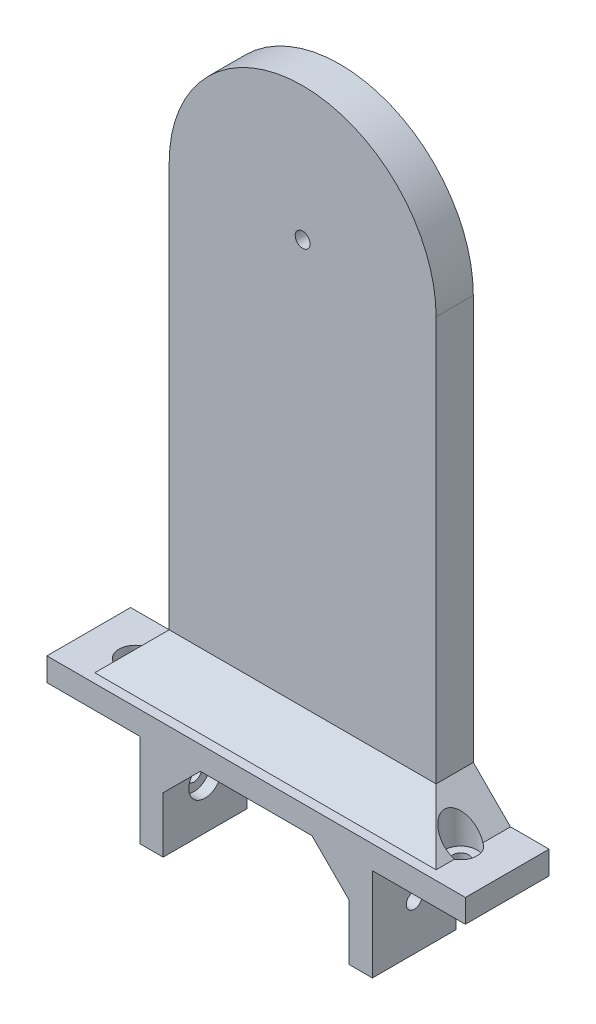
ISO-10303-21;
HEADER;
FILE_DESCRIPTION(('STEP AP214'),'2;1');
FILE_NAME('part.step','',(''),(''),'','','');
FILE_SCHEMA(('AUTOMOTIVE_DESIGN { 1 0 10303 214 1 1 1 1 }'));
ENDSEC;
DATA;
#1=APPLICATION_CONTEXT('core data for automotive mechanical design processes');
#2=APPLICATION_PROTOCOL_DEFINITION('international standard','automotive_design',2000,#1);
#3=PRODUCT_CONTEXT('',#1,'mechanical');
#4=PRODUCT('Part','Part','',(#3));
#5=PRODUCT_RELATED_PRODUCT_CATEGORY('part','',(#4));
#6=PRODUCT_DEFINITION_FORMATION('','',#4);
#7=PRODUCT_DEFINITION_CONTEXT('part definition',#1,'design');
#8=PRODUCT_DEFINITION('design','',#6,#7);
#9=PRODUCT_DEFINITION_SHAPE('','',#8);
#10=(LENGTH_UNIT() NAMED_UNIT(*) SI_UNIT(.MILLI.,.METRE.));
#11=(NAMED_UNIT(*) PLANE_ANGLE_UNIT() SI_UNIT($,.RADIAN.));
#12=(NAMED_UNIT(*) SI_UNIT($,.STERADIAN.) SOLID_ANGLE_UNIT());
#13=UNCERTAINTY_MEASURE_WITH_UNIT(LENGTH_MEASURE(1.E-05),#10,'distance_accuracy_value','');
#14=(GEOMETRIC_REPRESENTATION_CONTEXT(3) GLOBAL_UNCERTAINTY_ASSIGNED_CONTEXT((#13)) GLOBAL_UNIT_ASSIGNED_CONTEXT((#10,
#11,#12)) REPRESENTATION_CONTEXT('',''));
#15=CARTESIAN_POINT('',(0.,0.,0.));
#16=DIRECTION('',(0.,0.,1.));
#17=DIRECTION('',(1.,0.,0.));
#18=AXIS2_PLACEMENT_3D('',#15,#16,#17);
#19=CARTESIAN_POINT('',(20.,-8.00000000000006,8.));
#20=DIRECTION('',(-0.707106781186552,-0.707106781186543,0.));
#21=DIRECTION('',(0.,0.,1.));
#22=AXIS2_PLACEMENT_3D('',#19,#20,#21);
#23=PLANE('',#22);
#24=CARTESIAN_POINT('',(21.9999999999999,-10.,9.));
#25=DIRECTION('',(-0.707106781186552,-0.707106781186543,0.));
#26=DIRECTION('',(0.707106781186543,-0.707106781186552,0.));
#27=AXIS2_PLACEMENT_3D('',#24,#25,#26);
#28=ELLIPSE('',#27,4.9497474683058,3.5);
#29=CARTESIAN_POINT('',(20.,-8.00000000000006,11.8722813232691));
#30=VERTEX_POINT('',#29);
#31=CARTESIAN_POINT('',(20.,-8.00000000000006,6.12771867673095));
#32=VERTEX_POINT('',#31);
#33=EDGE_CURVE('E214',#30,#32,#28,.T.);
#34=ORIENTED_EDGE('',*,*,#33,.F.);
#35=DIRECTION('',(0.,0.,-1.));
#36=VECTOR('',#35,1.);
#37=CARTESIAN_POINT('',(20.,-8.00000000000006,0.));
#38=LINE('',#37,#36);
#39=CARTESIAN_POINT('',(20.,-8.00000000000005,18.));
#40=VERTEX_POINT('',#39);
#41=EDGE_CURVE('E426',#40,#30,#38,.T.);
#42=ORIENTED_EDGE('',*,*,#41,.F.);
#43=DIRECTION('',(-0.707106781186543,0.707106781186552,0.));
#44=VECTOR('',#43,1.);
#45=CARTESIAN_POINT('',(6.00000000000009,6.00000000000002,18.));
#46=LINE('',#45,#44);
#47=CARTESIAN_POINT('',(12.,0.,18.));
#48=VERTEX_POINT('',#47);
#49=EDGE_CURVE('E226',#48,#40,#46,.F.);
#50=ORIENTED_EDGE('',*,*,#49,.F.);
#51=DIRECTION('',(0.,0.,1.));
#52=VECTOR('',#51,1.);
#53=CARTESIAN_POINT('',(12.,0.,18.));
#54=LINE('',#53,#52);
#55=CARTESIAN_POINT('',(12.,0.,0.));
#56=VERTEX_POINT('',#55);
#57=EDGE_CURVE('E218',#56,#48,#54,.T.);
#58=ORIENTED_EDGE('',*,*,#57,.F.);
#59=DIRECTION('',(0.707106781186543,-0.707106781186552,0.));
#60=VECTOR('',#59,1.);
#61=CARTESIAN_POINT('',(6.00000000000009,6.00000000000002,0.));
#62=LINE('',#61,#60);
#63=CARTESIAN_POINT('',(20.,-8.00000000000006,0.));
#64=VERTEX_POINT('',#63);
#65=EDGE_CURVE('E228',#64,#56,#62,.F.);
#66=ORIENTED_EDGE('',*,*,#65,.F.);
#67=EDGE_CURVE('E430',#32,#64,#38,.T.);
#68=ORIENTED_EDGE('',*,*,#67,.F.);
#69=EDGE_LOOP('',(#34,#42,#50,#58,#66,#68));
#70=FACE_BOUND('',#69,.T.);
#71=ADVANCED_FACE('F43',(#70),#23,.T.);
#72=CARTESIAN_POINT('',(28.7,13.,8.));
#73=DIRECTION('',(0.707106781186544,0.707106781186551,0.));
#74=DIRECTION('',(0.,0.,1.));
#75=AXIS2_PLACEMENT_3D('',#72,#73,#74);
#76=PLANE('',#75);
#77=DIRECTION('',(0.,0.,1.));
#78=VECTOR('',#77,1.);
#79=CARTESIAN_POINT('',(36.7,5.,8.));
#80=LINE('',#79,#78);
#81=CARTESIAN_POINT('',(36.7,5.,12.0594117081556));
#82=VERTEX_POINT('',#81);
#83=CARTESIAN_POINT('',(36.7,5.,16.));
#84=VERTEX_POINT('',#83);
#85=EDGE_CURVE('E418',#82,#84,#80,.T.);
#86=ORIENTED_EDGE('',*,*,#85,.F.);
#87=CARTESIAN_POINT('',(35.,6.70000000000003,9.));
#88=DIRECTION('',(0.707106781186544,0.707106781186551,0.));
#89=DIRECTION('',(0.707106781186551,-0.707106781186544,0.));
#90=AXIS2_PLACEMENT_3D('',#87,#88,#89);
#91=ELLIPSE('',#90,4.94974746830581,3.5);
#92=CARTESIAN_POINT('',(36.7,5.,5.94058829184436));
#93=VERTEX_POINT('',#92);
#94=EDGE_CURVE('E253',#82,#93,#91,.F.);
#95=ORIENTED_EDGE('',*,*,#94,.T.);
#96=CARTESIAN_POINT('',(36.7,5.,0.));
#97=VERTEX_POINT('',#96);
#98=EDGE_CURVE('E420',#97,#93,#80,.T.);
#99=ORIENTED_EDGE('',*,*,#98,.F.);
#100=DIRECTION('',(-0.707106781186551,0.707106781186544,0.));
#101=VECTOR('',#100,1.);
#102=CARTESIAN_POINT('',(20.8499999999999,20.85,0.));
#103=LINE('',#102,#101);
#104=CARTESIAN_POINT('',(28.7,13.,0.));
#105=VERTEX_POINT('',#104);
#106=EDGE_CURVE('E217',#105,#97,#103,.F.);
#107=ORIENTED_EDGE('',*,*,#106,.F.);
#108=DIRECTION('',(0.,0.,-1.));
#109=VECTOR('',#108,1.);
#110=CARTESIAN_POINT('',(28.7,13.,0.));
#111=LINE('',#110,#109);
#112=CARTESIAN_POINT('',(28.7,13.,8.));
#113=VERTEX_POINT('',#112);
#114=EDGE_CURVE('E407',#113,#105,#111,.T.);
#115=ORIENTED_EDGE('',*,*,#114,.F.);
#116=DIRECTION('',(0.577350269189628,-0.577350269189622,0.577350269189628));
#117=VECTOR('',#116,1.);
#118=CARTESIAN_POINT('',(24.4666666666666,17.2333333333333,3.76666666666662));
#119=LINE('',#118,#117);
#120=EDGE_CURVE('E231',#113,#84,#119,.T.);
#121=ORIENTED_EDGE('',*,*,#120,.T.);
#122=EDGE_LOOP('',(#86,#95,#99,#107,#115,#121));
#123=FACE_BOUND('',#122,.T.);
#124=ADVANCED_FACE('F491',(#123),#76,.T.);
#125=CARTESIAN_POINT('',(0.,5.,8.));
#126=DIRECTION('',(0.,-1.,0.));
#127=DIRECTION('',(1.,0.,0.));
#128=AXIS2_PLACEMENT_3D('',#125,#126,#127);
#129=PLANE('',#128);
#130=DIRECTION('',(0.,0.,-1.));
#131=VECTOR('',#130,1.);
#132=CARTESIAN_POINT('',(-36.7,4.99999999999999,8.));
#133=LINE('',#132,#131);
#134=CARTESIAN_POINT('',(-36.7,4.99999999999999,16.));
#135=VERTEX_POINT('',#134);
#136=CARTESIAN_POINT('',(-36.7,4.99999999999999,12.0594117081556));
#137=VERTEX_POINT('',#136);
#138=EDGE_CURVE('E416',#135,#137,#133,.T.);
#139=ORIENTED_EDGE('',*,*,#138,.T.);
#140=CARTESIAN_POINT('',(-35.,4.99999999999999,9.));
#141=DIRECTION('',(0.,1.,0.));
#142=DIRECTION('',(0.,0.,1.));
#143=AXIS2_PLACEMENT_3D('',#140,#141,#142);
#144=CIRCLE('',#143,3.5);
#145=CARTESIAN_POINT('',(-36.7,4.99999999999999,5.94058829184435));
#146=VERTEX_POINT('',#145);
#147=EDGE_CURVE('E278',#146,#137,#144,.T.);
#148=ORIENTED_EDGE('',*,*,#147,.F.);
#149=CARTESIAN_POINT('',(-36.7,5.,0.));
#150=VERTEX_POINT('',#149);
#151=EDGE_CURVE('E411',#146,#150,#133,.T.);
#152=ORIENTED_EDGE('',*,*,#151,.T.);
#153=DIRECTION('',(1.,0.,0.));
#154=VECTOR('',#153,1.);
#155=CARTESIAN_POINT('',(0.,5.,0.));
#156=LINE('',#155,#154);
#157=CARTESIAN_POINT('',(-45.,5.,0.));
#158=VERTEX_POINT('',#157);
#159=EDGE_CURVE('E349',#158,#150,#156,.T.);
#160=ORIENTED_EDGE('',*,*,#159,.F.);
#161=DIRECTION('',(0.,0.,-1.));
#162=VECTOR('',#161,1.);
#163=CARTESIAN_POINT('',(-45.,5.,8.));
#164=LINE('',#163,#162);
#165=CARTESIAN_POINT('',(-45.,5.,18.));
#166=VERTEX_POINT('',#165);
#167=EDGE_CURVE('E405',#166,#158,#164,.T.);
#168=ORIENTED_EDGE('',*,*,#167,.F.);
#169=DIRECTION('',(-1.,0.,0.));
#170=VECTOR('',#169,1.);
#171=CARTESIAN_POINT('',(45.,5.,18.));
#172=LINE('',#171,#170);
#173=CARTESIAN_POINT('',(45.,5.,18.));
#174=VERTEX_POINT('',#173);
#175=EDGE_CURVE('E322',#174,#166,#172,.T.);
#176=ORIENTED_EDGE('',*,*,#175,.F.);
#177=DIRECTION('',(0.,0.,-1.));
#178=VECTOR('',#177,1.);
#179=CARTESIAN_POINT('',(45.,5.,8.));
#180=LINE('',#179,#178);
#181=CARTESIAN_POINT('',(45.,5.,0.));
#182=VERTEX_POINT('',#181);
#183=EDGE_CURVE('E338',#174,#182,#180,.T.);
#184=ORIENTED_EDGE('',*,*,#183,.T.);
#185=DIRECTION('',(-1.,0.,0.));
#186=VECTOR('',#185,1.);
#187=CARTESIAN_POINT('',(0.,5.,0.));
#188=LINE('',#187,#186);
#189=EDGE_CURVE('E335',#182,#97,#188,.T.);
#190=ORIENTED_EDGE('',*,*,#189,.T.);
#191=ORIENTED_EDGE('',*,*,#98,.T.);
#192=CARTESIAN_POINT('',(35.,5.,9.));
#193=DIRECTION('',(0.,1.,0.));
#194=DIRECTION('',(0.,0.,1.));
#195=AXIS2_PLACEMENT_3D('',#192,#193,#194);
#196=CIRCLE('',#195,3.5);
#197=EDGE_CURVE('E248',#82,#93,#196,.T.);
#198=ORIENTED_EDGE('',*,*,#197,.F.);
#199=ORIENTED_EDGE('',*,*,#85,.T.);
#200=DIRECTION('',(-1.,0.,0.));
#201=VECTOR('',#200,1.);
#202=CARTESIAN_POINT('',(0.,5.,16.));
#203=LINE('',#202,#201);
#204=EDGE_CURVE('E412',#84,#135,#203,.T.);
#205=ORIENTED_EDGE('',*,*,#204,.T.);
#206=EDGE_LOOP('',(#139,#148,#152,#160,#168,#176,#184,#190,#191,#198,#199,#205));
#207=FACE_BOUND('',#206,.T.);
#208=ADVANCED_FACE('F496',(#207),#129,.F.);
#209=CARTESIAN_POINT('',(28.7,0.,8.));
#210=DIRECTION('',(-1.,0.,0.));
#211=DIRECTION('',(0.,-1.,0.));
#212=AXIS2_PLACEMENT_3D('',#209,#210,#211);
#213=PLANE('',#212);
#214=DIRECTION('',(0.,1.,0.));
#215=VECTOR('',#214,1.);
#216=CARTESIAN_POINT('',(28.7,0.,8.));
#217=LINE('',#216,#215);
#218=CARTESIAN_POINT('',(28.7,100.,8.));
#219=VERTEX_POINT('',#218);
#220=EDGE_CURVE('E332',#113,#219,#217,.T.);
#221=ORIENTED_EDGE('',*,*,#220,.F.);
#222=ORIENTED_EDGE('',*,*,#114,.T.);
#223=DIRECTION('',(0.,1.,0.));
#224=VECTOR('',#223,1.);
#225=CARTESIAN_POINT('',(28.7,0.,0.));
#226=LINE('',#225,#224);
#227=CARTESIAN_POINT('',(28.7,100.,0.));
#228=VERTEX_POINT('',#227);
#229=EDGE_CURVE('E331',#105,#228,#226,.T.);
#230=ORIENTED_EDGE('',*,*,#229,.T.);
#231=DIRECTION('',(0.,0.,-1.));
#232=VECTOR('',#231,1.);
#233=CARTESIAN_POINT('',(28.7,100.,8.));
#234=LINE('',#233,#232);
#235=EDGE_CURVE('E406',#219,#228,#234,.T.);
#236=ORIENTED_EDGE('',*,*,#235,.F.);
#237=EDGE_LOOP('',(#221,#222,#230,#236));
#238=FACE_BOUND('',#237,.T.);
#239=ADVANCED_FACE('F486',(#238),#213,.F.);
#240=CARTESIAN_POINT('',(0.,100.,8.));
#241=DIRECTION('',(0.,0.,-1.));
#242=DIRECTION('',(-1.,0.,0.));
#243=AXIS2_PLACEMENT_3D('',#240,#241,#242);
#244=CYLINDRICAL_SURFACE('',#243,28.7);
#245=CARTESIAN_POINT('',(0.,100.,0.));
#246=DIRECTION('',(0.,0.,1.));
#247=DIRECTION('',(1.,0.,0.));
#248=AXIS2_PLACEMENT_3D('',#245,#246,#247);
#249=CIRCLE('',#248,28.7);
#250=CARTESIAN_POINT('',(-28.7,100.,0.));
#251=VERTEX_POINT('',#250);
#252=EDGE_CURVE('E341',#228,#251,#249,.T.);
#253=ORIENTED_EDGE('',*,*,#252,.T.);
#254=DIRECTION('',(0.,0.,-1.));
#255=VECTOR('',#254,1.);
#256=CARTESIAN_POINT('',(-28.7,100.,8.));
#257=LINE('',#256,#255);
#258=CARTESIAN_POINT('',(-28.7,100.,8.));
#259=VERTEX_POINT('',#258);
#260=EDGE_CURVE('E404',#259,#251,#257,.T.);
#261=ORIENTED_EDGE('',*,*,#260,.F.);
#262=CARTESIAN_POINT('',(0.,100.,8.));
#263=DIRECTION('',(0.,0.,1.));
#264=DIRECTION('',(1.,0.,0.));
#265=AXIS2_PLACEMENT_3D('',#262,#263,#264);
#266=CIRCLE('',#265,28.7);
#267=EDGE_CURVE('E333',#219,#259,#266,.T.);
#268=ORIENTED_EDGE('',*,*,#267,.F.);
#269=ORIENTED_EDGE('',*,*,#235,.T.);
#270=EDGE_LOOP('',(#253,#261,#268,#269));
#271=FACE_BOUND('',#270,.T.);
#272=ADVANCED_FACE('F483',(#271),#244,.T.);
#273=CARTESIAN_POINT('',(-28.7,0.,8.));
#274=DIRECTION('',(-1.,0.,0.));
#275=DIRECTION('',(0.,-1.,0.));
#276=AXIS2_PLACEMENT_3D('',#273,#274,#275);
#277=PLANE('',#276);
#278=DIRECTION('',(0.,1.,0.));
#279=VECTOR('',#278,1.);
#280=CARTESIAN_POINT('',(-28.7,0.,0.));
#281=LINE('',#280,#279);
#282=CARTESIAN_POINT('',(-28.7,13.,0.));
#283=VERTEX_POINT('',#282);
#284=EDGE_CURVE('E342',#283,#251,#281,.T.);
#285=ORIENTED_EDGE('',*,*,#284,.F.);
#286=DIRECTION('',(0.,0.,1.));
#287=VECTOR('',#286,1.);
#288=CARTESIAN_POINT('',(-28.7,13.,8.));
#289=LINE('',#288,#287);
#290=CARTESIAN_POINT('',(-28.7,13.,8.));
#291=VERTEX_POINT('',#290);
#292=EDGE_CURVE('E421',#283,#291,#289,.T.);
#293=ORIENTED_EDGE('',*,*,#292,.T.);
#294=DIRECTION('',(0.,1.,0.));
#295=VECTOR('',#294,1.);
#296=CARTESIAN_POINT('',(-28.7,0.,8.));
#297=LINE('',#296,#295);
#298=EDGE_CURVE('E336',#291,#259,#297,.T.);
#299=ORIENTED_EDGE('',*,*,#298,.T.);
#300=ORIENTED_EDGE('',*,*,#260,.T.);
#301=EDGE_LOOP('',(#285,#293,#299,#300));
#302=FACE_BOUND('',#301,.T.);
#303=ADVANCED_FACE('F478',(#302),#277,.T.);
#304=CARTESIAN_POINT('',(-45.,0.,8.));
#305=DIRECTION('',(-1.,0.,0.));
#306=DIRECTION('',(0.,0.,1.));
#307=AXIS2_PLACEMENT_3D('',#304,#305,#306);
#308=PLANE('',#307);
#309=DIRECTION('',(0.,1.,0.));
#310=VECTOR('',#309,1.);
#311=CARTESIAN_POINT('',(-45.,0.,0.));
#312=LINE('',#311,#310);
#313=CARTESIAN_POINT('',(-45.,0.,0.));
#314=VERTEX_POINT('',#313);
#315=EDGE_CURVE('E346',#314,#158,#312,.T.);
#316=ORIENTED_EDGE('',*,*,#315,.F.);
#317=DIRECTION('',(0.,0.,-1.));
#318=VECTOR('',#317,1.);
#319=CARTESIAN_POINT('',(-45.,0.,8.));
#320=LINE('',#319,#318);
#321=CARTESIAN_POINT('',(-45.,0.,18.));
#322=VERTEX_POINT('',#321);
#323=EDGE_CURVE('E400',#322,#314,#320,.T.);
#324=ORIENTED_EDGE('',*,*,#323,.F.);
#325=DIRECTION('',(0.,-1.,0.));
#326=VECTOR('',#325,1.);
#327=CARTESIAN_POINT('',(-45.,0.,18.));
#328=LINE('',#327,#326);
#329=EDGE_CURVE('E327',#166,#322,#328,.T.);
#330=ORIENTED_EDGE('',*,*,#329,.F.);
#331=ORIENTED_EDGE('',*,*,#167,.T.);
#332=EDGE_LOOP('',(#316,#324,#330,#331));
#333=FACE_BOUND('',#332,.T.);
#334=ADVANCED_FACE('F462',(#333),#308,.T.);
#335=CARTESIAN_POINT('',(0.,0.,8.));
#336=DIRECTION('',(0.,-1.,0.));
#337=DIRECTION('',(1.,0.,0.));
#338=AXIS2_PLACEMENT_3D('',#335,#336,#337);
#339=PLANE('',#338);
#340=CARTESIAN_POINT('',(-35.,0.,9.));
#341=DIRECTION('',(0.,-1.,0.));
#342=DIRECTION('',(1.,0.,0.));
#343=AXIS2_PLACEMENT_3D('',#340,#341,#342);
#344=CIRCLE('',#343,1.7);
#345=CARTESIAN_POINT('',(-33.3,0.,9.));
#346=VERTEX_POINT('',#345);
#347=EDGE_CURVE('E246',#346,#346,#344,.T.);
#348=ORIENTED_EDGE('',*,*,#347,.F.);
#349=EDGE_LOOP('',(#348));
#350=FACE_BOUND('',#349,.T.);
#351=DIRECTION('',(-1.,0.,0.));
#352=VECTOR('',#351,1.);
#353=CARTESIAN_POINT('',(0.,0.,0.));
#354=LINE('',#353,#352);
#355=CARTESIAN_POINT('',(-25.,0.,0.));
#356=VERTEX_POINT('',#355);
#357=EDGE_CURVE('E354',#356,#314,#354,.T.);
#358=ORIENTED_EDGE('',*,*,#357,.F.);
#359=DIRECTION('',(0.,0.,-1.));
#360=VECTOR('',#359,1.);
#361=CARTESIAN_POINT('',(-25.,0.,8.));
#362=LINE('',#361,#360);
#363=CARTESIAN_POINT('',(-25.,0.,18.));
#364=VERTEX_POINT('',#363);
#365=EDGE_CURVE('E399',#364,#356,#362,.T.);
#366=ORIENTED_EDGE('',*,*,#365,.F.);
#367=DIRECTION('',(1.,0.,0.));
#368=VECTOR('',#367,1.);
#369=CARTESIAN_POINT('',(-25.,0.,18.));
#370=LINE('',#369,#368);
#371=EDGE_CURVE('E239',#322,#364,#370,.T.);
#372=ORIENTED_EDGE('',*,*,#371,.F.);
#373=ORIENTED_EDGE('',*,*,#323,.T.);
#374=EDGE_LOOP('',(#358,#366,#372,#373));
#375=FACE_BOUND('',#374,.T.);
#376=ADVANCED_FACE('F457',(#350,#375),#339,.T.);
#377=CARTESIAN_POINT('',(-25.,0.,8.));
#378=DIRECTION('',(-1.,0.,0.));
#379=DIRECTION('',(0.,0.,1.));
#380=AXIS2_PLACEMENT_3D('',#377,#378,#379);
#381=PLANE('',#380);
#382=CARTESIAN_POINT('',(-25.,-10.,9.));
#383=DIRECTION('',(-1.,0.,0.));
#384=DIRECTION('',(0.,0.,1.));
#385=AXIS2_PLACEMENT_3D('',#382,#383,#384);
#386=CIRCLE('',#385,1.7);
#387=CARTESIAN_POINT('',(-25.,-10.,10.7));
#388=VERTEX_POINT('',#387);
#389=EDGE_CURVE('E256',#388,#388,#386,.T.);
#390=ORIENTED_EDGE('',*,*,#389,.F.);
#391=EDGE_LOOP('',(#390));
#392=FACE_BOUND('',#391,.T.);
#393=DIRECTION('',(0.,1.,0.));
#394=VECTOR('',#393,1.);
#395=CARTESIAN_POINT('',(-25.,0.,0.));
#396=LINE('',#395,#394);
#397=CARTESIAN_POINT('',(-25.,-20.,0.));
#398=VERTEX_POINT('',#397);
#399=EDGE_CURVE('E358',#398,#356,#396,.T.);
#400=ORIENTED_EDGE('',*,*,#399,.F.);
#401=DIRECTION('',(0.,0.,-1.));
#402=VECTOR('',#401,1.);
#403=CARTESIAN_POINT('',(-25.,-20.,8.));
#404=LINE('',#403,#402);
#405=CARTESIAN_POINT('',(-25.,-20.,18.));
#406=VERTEX_POINT('',#405);
#407=EDGE_CURVE('E396',#406,#398,#404,.T.);
#408=ORIENTED_EDGE('',*,*,#407,.F.);
#409=DIRECTION('',(0.,-1.,0.));
#410=VECTOR('',#409,1.);
#411=CARTESIAN_POINT('',(-25.,-20.,18.));
#412=LINE('',#411,#410);
#413=EDGE_CURVE('E297',#364,#406,#412,.T.);
#414=ORIENTED_EDGE('',*,*,#413,.F.);
#415=ORIENTED_EDGE('',*,*,#365,.T.);
#416=EDGE_LOOP('',(#400,#408,#414,#415));
#417=FACE_BOUND('',#416,.T.);
#418=ADVANCED_FACE('F453',(#392,#417),#381,.T.);
#419=CARTESIAN_POINT('',(0.,-20.,8.));
#420=DIRECTION('',(0.,-1.,0.));
#421=DIRECTION('',(1.,0.,0.));
#422=AXIS2_PLACEMENT_3D('',#419,#420,#421);
#423=PLANE('',#422);
#424=DIRECTION('',(-1.,0.,0.));
#425=VECTOR('',#424,1.);
#426=CARTESIAN_POINT('',(0.,-20.,0.));
#427=LINE('',#426,#425);
#428=CARTESIAN_POINT('',(-20.,-20.,0.));
#429=VERTEX_POINT('',#428);
#430=EDGE_CURVE('E360',#429,#398,#427,.T.);
#431=ORIENTED_EDGE('',*,*,#430,.F.);
#432=DIRECTION('',(0.,0.,-1.));
#433=VECTOR('',#432,1.);
#434=CARTESIAN_POINT('',(-20.,-20.,8.));
#435=LINE('',#434,#433);
#436=CARTESIAN_POINT('',(-20.,-20.,18.));
#437=VERTEX_POINT('',#436);
#438=EDGE_CURVE('E392',#437,#429,#435,.T.);
#439=ORIENTED_EDGE('',*,*,#438,.F.);
#440=DIRECTION('',(1.,0.,0.));
#441=VECTOR('',#440,1.);
#442=CARTESIAN_POINT('',(-20.,-20.,18.));
#443=LINE('',#442,#441);
#444=EDGE_CURVE('E303',#406,#437,#443,.T.);
#445=ORIENTED_EDGE('',*,*,#444,.F.);
#446=ORIENTED_EDGE('',*,*,#407,.T.);
#447=EDGE_LOOP('',(#431,#439,#445,#446));
#448=FACE_BOUND('',#447,.T.);
#449=ADVANCED_FACE('F448',(#448),#423,.T.);
#450=CARTESIAN_POINT('',(-20.,0.,8.));
#451=DIRECTION('',(1.,0.,0.));
#452=DIRECTION('',(0.,1.,0.));
#453=AXIS2_PLACEMENT_3D('',#450,#451,#452);
#454=PLANE('',#453);
#455=CARTESIAN_POINT('',(-20.,-10.,9.));
#456=DIRECTION('',(1.,0.,0.));
#457=DIRECTION('',(0.,0.,-1.));
#458=AXIS2_PLACEMENT_3D('',#455,#456,#457);
#459=CIRCLE('',#458,3.5);
#460=CARTESIAN_POINT('',(-20.,-7.99999999999999,11.872281323269));
#461=VERTEX_POINT('',#460);
#462=CARTESIAN_POINT('',(-20.,-7.99999999999999,6.127718676731));
#463=VERTEX_POINT('',#462);
#464=EDGE_CURVE('E55',#461,#463,#459,.T.);
#465=ORIENTED_EDGE('',*,*,#464,.F.);
#466=DIRECTION('',(0.,0.,1.));
#467=VECTOR('',#466,1.);
#468=CARTESIAN_POINT('',(-20.,-7.99999999999999,8.));
#469=LINE('',#468,#467);
#470=CARTESIAN_POINT('',(-20.,-7.99999999999999,18.));
#471=VERTEX_POINT('',#470);
#472=EDGE_CURVE('E56',#461,#471,#469,.T.);
#473=ORIENTED_EDGE('',*,*,#472,.T.);
#474=DIRECTION('',(0.,1.,0.));
#475=VECTOR('',#474,1.);
#476=CARTESIAN_POINT('',(-20.,-20.,18.));
#477=LINE('',#476,#475);
#478=EDGE_CURVE('E306',#437,#471,#477,.T.);
#479=ORIENTED_EDGE('',*,*,#478,.F.);
#480=ORIENTED_EDGE('',*,*,#438,.T.);
#481=DIRECTION('',(0.,-1.,0.));
#482=VECTOR('',#481,1.);
#483=CARTESIAN_POINT('',(-20.,0.,0.));
#484=LINE('',#483,#482);
#485=CARTESIAN_POINT('',(-20.,-7.99999999999999,0.));
#486=VERTEX_POINT('',#485);
#487=EDGE_CURVE('E365',#486,#429,#484,.T.);
#488=ORIENTED_EDGE('',*,*,#487,.F.);
#489=EDGE_CURVE('E208',#486,#463,#469,.T.);
#490=ORIENTED_EDGE('',*,*,#489,.T.);
#491=EDGE_LOOP('',(#465,#473,#479,#480,#488,#490));
#492=FACE_BOUND('',#491,.T.);
#493=ADVANCED_FACE('F209',(#492),#454,.T.);
#494=CARTESIAN_POINT('',(0.,0.,8.));
#495=DIRECTION('',(0.,1.,0.));
#496=DIRECTION('',(-1.,0.,0.));
#497=AXIS2_PLACEMENT_3D('',#494,#495,#496);
#498=PLANE('',#497);
#499=DIRECTION('',(1.,0.,0.));
#500=VECTOR('',#499,1.);
#501=CARTESIAN_POINT('',(0.,0.,0.));
#502=LINE('',#501,#500);
#503=CARTESIAN_POINT('',(-11.9999999999999,0.,0.));
#504=VERTEX_POINT('',#503);
#505=EDGE_CURVE('E364',#504,#56,#502,.T.);
#506=ORIENTED_EDGE('',*,*,#505,.T.);
#507=ORIENTED_EDGE('',*,*,#57,.T.);
#508=DIRECTION('',(1.,0.,0.));
#509=VECTOR('',#508,1.);
#510=CARTESIAN_POINT('',(-20.,0.,18.));
#511=LINE('',#510,#509);
#512=CARTESIAN_POINT('',(-11.9999999999999,0.,18.));
#513=VERTEX_POINT('',#512);
#514=EDGE_CURVE('E308',#513,#48,#511,.T.);
#515=ORIENTED_EDGE('',*,*,#514,.F.);
#516=DIRECTION('',(0.,0.,-1.));
#517=VECTOR('',#516,1.);
#518=CARTESIAN_POINT('',(-11.9999999999999,0.,8.));
#519=LINE('',#518,#517);
#520=EDGE_CURVE('E220',#513,#504,#519,.T.);
#521=ORIENTED_EDGE('',*,*,#520,.T.);
#522=EDGE_LOOP('',(#506,#507,#515,#521));
#523=FACE_BOUND('',#522,.T.);
#524=ADVANCED_FACE('F433',(#523),#498,.F.);
#525=CARTESIAN_POINT('',(20.,0.,8.));
#526=DIRECTION('',(1.,0.,0.));
#527=DIRECTION('',(0.,1.,0.));
#528=AXIS2_PLACEMENT_3D('',#525,#526,#527);
#529=PLANE('',#528);
#530=ORIENTED_EDGE('',*,*,#41,.T.);
#531=CARTESIAN_POINT('',(20.,-10.,9.));
#532=DIRECTION('',(-1.,0.,0.));
#533=DIRECTION('',(0.,0.,1.));
#534=AXIS2_PLACEMENT_3D('',#531,#532,#533);
#535=CIRCLE('',#534,3.5);
#536=EDGE_CURVE('E258',#32,#30,#535,.T.);
#537=ORIENTED_EDGE('',*,*,#536,.F.);
#538=ORIENTED_EDGE('',*,*,#67,.T.);
#539=DIRECTION('',(0.,-1.,0.));
#540=VECTOR('',#539,1.);
#541=CARTESIAN_POINT('',(20.,0.,0.));
#542=LINE('',#541,#540);
#543=CARTESIAN_POINT('',(20.,-20.,0.));
#544=VERTEX_POINT('',#543);
#545=EDGE_CURVE('E370',#64,#544,#542,.T.);
#546=ORIENTED_EDGE('',*,*,#545,.T.);
#547=DIRECTION('',(0.,0.,-1.));
#548=VECTOR('',#547,1.);
#549=CARTESIAN_POINT('',(20.,-20.,8.));
#550=LINE('',#549,#548);
#551=CARTESIAN_POINT('',(20.,-20.,18.));
#552=VERTEX_POINT('',#551);
#553=EDGE_CURVE('E387',#552,#544,#550,.T.);
#554=ORIENTED_EDGE('',*,*,#553,.F.);
#555=DIRECTION('',(0.,-1.,0.));
#556=VECTOR('',#555,1.);
#557=CARTESIAN_POINT('',(20.,0.,18.));
#558=LINE('',#557,#556);
#559=EDGE_CURVE('E311',#40,#552,#558,.T.);
#560=ORIENTED_EDGE('',*,*,#559,.F.);
#561=EDGE_LOOP('',(#530,#537,#538,#546,#554,#560));
#562=FACE_BOUND('',#561,.T.);
#563=ADVANCED_FACE('F513',(#562),#529,.F.);
#564=CARTESIAN_POINT('',(0.,-20.,8.));
#565=DIRECTION('',(0.,1.,0.));
#566=DIRECTION('',(-1.,0.,0.));
#567=AXIS2_PLACEMENT_3D('',#564,#565,#566);
#568=PLANE('',#567);
#569=DIRECTION('',(1.,0.,0.));
#570=VECTOR('',#569,1.);
#571=CARTESIAN_POINT('',(0.,-20.,0.));
#572=LINE('',#571,#570);
#573=CARTESIAN_POINT('',(25.,-20.,0.));
#574=VERTEX_POINT('',#573);
#575=EDGE_CURVE('E367',#544,#574,#572,.T.);
#576=ORIENTED_EDGE('',*,*,#575,.T.);
#577=DIRECTION('',(0.,0.,-1.));
#578=VECTOR('',#577,1.);
#579=CARTESIAN_POINT('',(25.,-20.,8.));
#580=LINE('',#579,#578);
#581=CARTESIAN_POINT('',(25.,-20.,18.));
#582=VERTEX_POINT('',#581);
#583=EDGE_CURVE('E386',#582,#574,#580,.T.);
#584=ORIENTED_EDGE('',*,*,#583,.F.);
#585=DIRECTION('',(1.,0.,0.));
#586=VECTOR('',#585,1.);
#587=CARTESIAN_POINT('',(20.,-20.,18.));
#588=LINE('',#587,#586);
#589=EDGE_CURVE('E312',#552,#582,#588,.T.);
#590=ORIENTED_EDGE('',*,*,#589,.F.);
#591=ORIENTED_EDGE('',*,*,#553,.T.);
#592=EDGE_LOOP('',(#576,#584,#590,#591));
#593=FACE_BOUND('',#592,.T.);
#594=ADVANCED_FACE('F515',(#593),#568,.F.);
#595=CARTESIAN_POINT('',(25.,0.,8.));
#596=DIRECTION('',(-1.,0.,0.));
#597=DIRECTION('',(0.,0.,1.));
#598=AXIS2_PLACEMENT_3D('',#595,#596,#597);
#599=PLANE('',#598);
#600=CARTESIAN_POINT('',(25.,-10.,9.));
#601=DIRECTION('',(-1.,0.,0.));
#602=DIRECTION('',(0.,0.,1.));
#603=AXIS2_PLACEMENT_3D('',#600,#601,#602);
#604=CIRCLE('',#603,1.7);
#605=CARTESIAN_POINT('',(25.,-10.,10.7));
#606=VERTEX_POINT('',#605);
#607=EDGE_CURVE('E255',#606,#606,#604,.T.);
#608=ORIENTED_EDGE('',*,*,#607,.T.);
#609=EDGE_LOOP('',(#608));
#610=FACE_BOUND('',#609,.T.);
#611=DIRECTION('',(0.,1.,0.));
#612=VECTOR('',#611,1.);
#613=CARTESIAN_POINT('',(25.,0.,0.));
#614=LINE('',#613,#612);
#615=CARTESIAN_POINT('',(25.,0.,0.));
#616=VERTEX_POINT('',#615);
#617=EDGE_CURVE('E371',#574,#616,#614,.T.);
#618=ORIENTED_EDGE('',*,*,#617,.T.);
#619=DIRECTION('',(0.,0.,-1.));
#620=VECTOR('',#619,1.);
#621=CARTESIAN_POINT('',(25.,0.,8.));
#622=LINE('',#621,#620);
#623=CARTESIAN_POINT('',(25.,0.,18.));
#624=VERTEX_POINT('',#623);
#625=EDGE_CURVE('E381',#624,#616,#622,.T.);
#626=ORIENTED_EDGE('',*,*,#625,.F.);
#627=DIRECTION('',(0.,1.,0.));
#628=VECTOR('',#627,1.);
#629=CARTESIAN_POINT('',(25.,-20.,18.));
#630=LINE('',#629,#628);
#631=EDGE_CURVE('E317',#582,#624,#630,.T.);
#632=ORIENTED_EDGE('',*,*,#631,.F.);
#633=ORIENTED_EDGE('',*,*,#583,.T.);
#634=EDGE_LOOP('',(#618,#626,#632,#633));
#635=FACE_BOUND('',#634,.T.);
#636=ADVANCED_FACE('F509',(#610,#635),#599,.F.);
#637=CARTESIAN_POINT('',(0.,0.,8.));
#638=DIRECTION('',(0.,1.,0.));
#639=DIRECTION('',(-1.,0.,0.));
#640=AXIS2_PLACEMENT_3D('',#637,#638,#639);
#641=PLANE('',#640);
#642=CARTESIAN_POINT('',(35.,0.,9.));
#643=DIRECTION('',(0.,1.,0.));
#644=DIRECTION('',(-1.,0.,0.));
#645=AXIS2_PLACEMENT_3D('',#642,#643,#644);
#646=CIRCLE('',#645,1.7);
#647=CARTESIAN_POINT('',(33.3,0.,9.));
#648=VERTEX_POINT('',#647);
#649=EDGE_CURVE('E241',#648,#648,#646,.T.);
#650=ORIENTED_EDGE('',*,*,#649,.T.);
#651=EDGE_LOOP('',(#650));
#652=FACE_BOUND('',#651,.T.);
#653=DIRECTION('',(1.,0.,0.));
#654=VECTOR('',#653,1.);
#655=CARTESIAN_POINT('',(0.,0.,0.));
#656=LINE('',#655,#654);
#657=CARTESIAN_POINT('',(45.,0.,0.));
#658=VERTEX_POINT('',#657);
#659=EDGE_CURVE('E373',#616,#658,#656,.T.);
#660=ORIENTED_EDGE('',*,*,#659,.T.);
#661=DIRECTION('',(0.,0.,-1.));
#662=VECTOR('',#661,1.);
#663=CARTESIAN_POINT('',(45.,0.,8.));
#664=LINE('',#663,#662);
#665=CARTESIAN_POINT('',(45.,0.,18.));
#666=VERTEX_POINT('',#665);
#667=EDGE_CURVE('E382',#666,#658,#664,.T.);
#668=ORIENTED_EDGE('',*,*,#667,.F.);
#669=DIRECTION('',(1.,0.,0.));
#670=VECTOR('',#669,1.);
#671=CARTESIAN_POINT('',(25.,0.,18.));
#672=LINE('',#671,#670);
#673=EDGE_CURVE('E316',#624,#666,#672,.T.);
#674=ORIENTED_EDGE('',*,*,#673,.F.);
#675=ORIENTED_EDGE('',*,*,#625,.T.);
#676=EDGE_LOOP('',(#660,#668,#674,#675));
#677=FACE_BOUND('',#676,.T.);
#678=ADVANCED_FACE('F506',(#652,#677),#641,.F.);
#679=CARTESIAN_POINT('',(45.,0.,8.));
#680=DIRECTION('',(-1.,0.,0.));
#681=DIRECTION('',(0.,0.,1.));
#682=AXIS2_PLACEMENT_3D('',#679,#680,#681);
#683=PLANE('',#682);
#684=DIRECTION('',(0.,1.,0.));
#685=VECTOR('',#684,1.);
#686=CARTESIAN_POINT('',(45.,0.,0.));
#687=LINE('',#686,#685);
#688=EDGE_CURVE('E374',#658,#182,#687,.T.);
#689=ORIENTED_EDGE('',*,*,#688,.T.);
#690=ORIENTED_EDGE('',*,*,#183,.F.);
#691=DIRECTION('',(0.,1.,0.));
#692=VECTOR('',#691,1.);
#693=CARTESIAN_POINT('',(45.,0.,18.));
#694=LINE('',#693,#692);
#695=EDGE_CURVE('E321',#666,#174,#694,.T.);
#696=ORIENTED_EDGE('',*,*,#695,.F.);
#697=ORIENTED_EDGE('',*,*,#667,.T.);
#698=EDGE_LOOP('',(#689,#690,#696,#697));
#699=FACE_BOUND('',#698,.T.);
#700=ADVANCED_FACE('F505',(#699),#683,.F.);
#701=CARTESIAN_POINT('',(0.,0.,8.));
#702=DIRECTION('',(0.,0.,1.));
#703=DIRECTION('',(1.,0.,0.));
#704=AXIS2_PLACEMENT_3D('',#701,#702,#703);
#705=PLANE('',#704);
#706=CARTESIAN_POINT('',(0.,100.,8.));
#707=DIRECTION('',(0.,0.,1.));
#708=DIRECTION('',(1.,0.,0.));
#709=AXIS2_PLACEMENT_3D('',#706,#707,#708);
#710=CIRCLE('',#709,1.6);
#711=CARTESIAN_POINT('',(1.6,100.,8.));
#712=VERTEX_POINT('',#711);
#713=EDGE_CURVE('E240',#712,#712,#710,.T.);
#714=ORIENTED_EDGE('',*,*,#713,.F.);
#715=EDGE_LOOP('',(#714));
#716=FACE_BOUND('',#715,.T.);
#717=ORIENTED_EDGE('',*,*,#298,.F.);
#718=DIRECTION('',(1.,0.,0.));
#719=VECTOR('',#718,1.);
#720=CARTESIAN_POINT('',(0.,13.,8.));
#721=LINE('',#720,#719);
#722=EDGE_CURVE('E424',#291,#113,#721,.T.);
#723=ORIENTED_EDGE('',*,*,#722,.T.);
#724=ORIENTED_EDGE('',*,*,#220,.T.);
#725=ORIENTED_EDGE('',*,*,#267,.T.);
#726=EDGE_LOOP('',(#717,#723,#724,#725));
#727=FACE_BOUND('',#726,.T.);
#728=ADVANCED_FACE('F477',(#716,#727),#705,.T.);
#729=CARTESIAN_POINT('',(0.,0.,0.));
#730=DIRECTION('',(0.,0.,1.));
#731=DIRECTION('',(1.,0.,0.));
#732=AXIS2_PLACEMENT_3D('',#729,#730,#731);
#733=PLANE('',#732);
#734=CARTESIAN_POINT('',(0.,100.,0.));
#735=DIRECTION('',(0.,0.,-1.));
#736=DIRECTION('',(-1.,0.,0.));
#737=AXIS2_PLACEMENT_3D('',#734,#735,#736);
#738=CIRCLE('',#737,1.6);
#739=CARTESIAN_POINT('',(-1.6,100.,0.));
#740=VERTEX_POINT('',#739);
#741=EDGE_CURVE('E242',#740,#740,#738,.T.);
#742=ORIENTED_EDGE('',*,*,#741,.F.);
#743=EDGE_LOOP('',(#742));
#744=FACE_BOUND('',#743,.T.);
#745=ORIENTED_EDGE('',*,*,#229,.F.);
#746=ORIENTED_EDGE('',*,*,#106,.T.);
#747=ORIENTED_EDGE('',*,*,#189,.F.);
#748=ORIENTED_EDGE('',*,*,#688,.F.);
#749=ORIENTED_EDGE('',*,*,#659,.F.);
#750=ORIENTED_EDGE('',*,*,#617,.F.);
#751=ORIENTED_EDGE('',*,*,#575,.F.);
#752=ORIENTED_EDGE('',*,*,#545,.F.);
#753=ORIENTED_EDGE('',*,*,#65,.T.);
#754=ORIENTED_EDGE('',*,*,#505,.F.);
#755=DIRECTION('',(-0.707106781186551,-0.707106781186544,0.));
#756=VECTOR('',#755,1.);
#757=CARTESIAN_POINT('',(-5.99999999999991,5.99999999999997,0.));
#758=LINE('',#757,#756);
#759=EDGE_CURVE('E69',#504,#486,#758,.T.);
#760=ORIENTED_EDGE('',*,*,#759,.T.);
#761=ORIENTED_EDGE('',*,*,#487,.T.);
#762=ORIENTED_EDGE('',*,*,#430,.T.);
#763=ORIENTED_EDGE('',*,*,#399,.T.);
#764=ORIENTED_EDGE('',*,*,#357,.T.);
#765=ORIENTED_EDGE('',*,*,#315,.T.);
#766=ORIENTED_EDGE('',*,*,#159,.T.);
#767=DIRECTION('',(0.707106781186551,0.707106781186544,0.));
#768=VECTOR('',#767,1.);
#769=CARTESIAN_POINT('',(-20.8499999999999,20.85,0.));
#770=LINE('',#769,#768);
#771=EDGE_CURVE('E223',#150,#283,#770,.T.);
#772=ORIENTED_EDGE('',*,*,#771,.T.);
#773=ORIENTED_EDGE('',*,*,#284,.T.);
#774=ORIENTED_EDGE('',*,*,#252,.F.);
#775=EDGE_LOOP('',(#745,#746,#747,#748,#749,#750,#751,#752,#753,#754,#760,#761,#762,#763,#764,
#765,#766,#772,#773,#774));
#776=FACE_BOUND('',#775,.T.);
#777=ADVANCED_FACE('F436',(#744,#776),#733,.F.);
#778=CARTESIAN_POINT('',(0.,0.,18.));
#779=DIRECTION('',(0.,0.,-1.));
#780=DIRECTION('',(-1.,0.,0.));
#781=AXIS2_PLACEMENT_3D('',#778,#779,#780);
#782=PLANE('',#781);
#783=ORIENTED_EDGE('',*,*,#371,.T.);
#784=ORIENTED_EDGE('',*,*,#413,.T.);
#785=ORIENTED_EDGE('',*,*,#444,.T.);
#786=ORIENTED_EDGE('',*,*,#478,.T.);
#787=DIRECTION('',(0.707106781186551,0.707106781186544,0.));
#788=VECTOR('',#787,1.);
#789=CARTESIAN_POINT('',(-5.99999999999991,5.99999999999997,18.));
#790=LINE('',#789,#788);
#791=EDGE_CURVE('E212',#471,#513,#790,.T.);
#792=ORIENTED_EDGE('',*,*,#791,.T.);
#793=ORIENTED_EDGE('',*,*,#514,.T.);
#794=ORIENTED_EDGE('',*,*,#49,.T.);
#795=ORIENTED_EDGE('',*,*,#559,.T.);
#796=ORIENTED_EDGE('',*,*,#589,.T.);
#797=ORIENTED_EDGE('',*,*,#631,.T.);
#798=ORIENTED_EDGE('',*,*,#673,.T.);
#799=ORIENTED_EDGE('',*,*,#695,.T.);
#800=ORIENTED_EDGE('',*,*,#175,.T.);
#801=ORIENTED_EDGE('',*,*,#329,.T.);
#802=EDGE_LOOP('',(#783,#784,#785,#786,#792,#793,#794,#795,#796,#797,#798,#799,#800,#801));
#803=FACE_BOUND('',#802,.T.);
#804=ADVANCED_FACE('F444',(#803),#782,.F.);
#805=CARTESIAN_POINT('',(-36.7,4.99999999999999,8.));
#806=DIRECTION('',(0.707106781186544,-0.707106781186551,0.));
#807=DIRECTION('',(0.,0.,-1.));
#808=AXIS2_PLACEMENT_3D('',#805,#806,#807);
#809=PLANE('',#808);
#810=CARTESIAN_POINT('',(-35.,6.70000000000001,9.));
#811=DIRECTION('',(0.707106781186544,-0.707106781186551,0.));
#812=DIRECTION('',(-0.707106781186551,-0.707106781186544,0.));
#813=AXIS2_PLACEMENT_3D('',#810,#811,#812);
#814=ELLIPSE('',#813,4.94974746830581,3.5);
#815=EDGE_CURVE('E235',#137,#146,#814,.F.);
#816=ORIENTED_EDGE('',*,*,#815,.F.);
#817=ORIENTED_EDGE('',*,*,#138,.F.);
#818=DIRECTION('',(-0.577350269189628,-0.577350269189622,0.577350269189628));
#819=VECTOR('',#818,1.);
#820=CARTESIAN_POINT('',(-24.4666666666666,17.2333333333333,3.76666666666662));
#821=LINE('',#820,#819);
#822=EDGE_CURVE('E236',#291,#135,#821,.T.);
#823=ORIENTED_EDGE('',*,*,#822,.F.);
#824=ORIENTED_EDGE('',*,*,#292,.F.);
#825=ORIENTED_EDGE('',*,*,#771,.F.);
#826=ORIENTED_EDGE('',*,*,#151,.F.);
#827=EDGE_LOOP('',(#816,#817,#823,#824,#825,#826));
#828=FACE_BOUND('',#827,.T.);
#829=ADVANCED_FACE('F468',(#828),#809,.F.);
#830=CARTESIAN_POINT('',(0.,5.,16.));
#831=DIRECTION('',(0.,-0.707106781186551,-0.707106781186544));
#832=DIRECTION('',(-1.,0.,0.));
#833=AXIS2_PLACEMENT_3D('',#830,#831,#832);
#834=PLANE('',#833);
#835=ORIENTED_EDGE('',*,*,#822,.T.);
#836=ORIENTED_EDGE('',*,*,#204,.F.);
#837=ORIENTED_EDGE('',*,*,#120,.F.);
#838=ORIENTED_EDGE('',*,*,#722,.F.);
#839=EDGE_LOOP('',(#835,#836,#837,#838));
#840=FACE_BOUND('',#839,.T.);
#841=ADVANCED_FACE('F552',(#840),#834,.F.);
#842=CARTESIAN_POINT('',(-11.9999999999999,0.,8.));
#843=DIRECTION('',(-0.707106781186544,0.707106781186551,0.));
#844=DIRECTION('',(0.,0.,-1.));
#845=AXIS2_PLACEMENT_3D('',#842,#843,#844);
#846=PLANE('',#845);
#847=ORIENTED_EDGE('',*,*,#472,.F.);
#848=CARTESIAN_POINT('',(-22.,-10.,9.));
#849=DIRECTION('',(-0.707106781186544,0.707106781186551,0.));
#850=DIRECTION('',(-0.707106781186551,-0.707106781186544,0.));
#851=AXIS2_PLACEMENT_3D('',#848,#849,#850);
#852=ELLIPSE('',#851,4.94974746830585,3.5);
#853=EDGE_CURVE('E11',#461,#463,#852,.T.);
#854=ORIENTED_EDGE('',*,*,#853,.T.);
#855=ORIENTED_EDGE('',*,*,#489,.F.);
#856=ORIENTED_EDGE('',*,*,#759,.F.);
#857=ORIENTED_EDGE('',*,*,#520,.F.);
#858=ORIENTED_EDGE('',*,*,#791,.F.);
#859=EDGE_LOOP('',(#847,#854,#855,#856,#857,#858));
#860=FACE_BOUND('',#859,.T.);
#861=ADVANCED_FACE('F46',(#860),#846,.F.);
#862=CARTESIAN_POINT('',(0.,100.,18.));
#863=DIRECTION('',(0.,0.,-1.));
#864=DIRECTION('',(-1.,0.,0.));
#865=AXIS2_PLACEMENT_3D('',#862,#863,#864);
#866=CYLINDRICAL_SURFACE('',#865,1.6);
#867=ORIENTED_EDGE('',*,*,#713,.T.);
#868=EDGE_LOOP('',(#867));
#869=FACE_BOUND('',#868,.T.);
#870=ORIENTED_EDGE('',*,*,#741,.T.);
#871=EDGE_LOOP('',(#870));
#872=FACE_BOUND('',#871,.T.);
#873=ADVANCED_FACE('F598',(#869,#872),#866,.F.);
#874=CARTESIAN_POINT('',(35.,5.,9.));
#875=DIRECTION('',(0.,1.,0.));
#876=DIRECTION('',(0.,0.,1.));
#877=AXIS2_PLACEMENT_3D('',#874,#875,#876);
#878=CYLINDRICAL_SURFACE('',#877,1.7);
#879=CARTESIAN_POINT('',(35.,2.6,9.));
#880=DIRECTION('',(0.,1.,0.));
#881=DIRECTION('',(0.,0.,1.));
#882=AXIS2_PLACEMENT_3D('',#879,#880,#881);
#883=CIRCLE('',#882,1.7);
#884=CARTESIAN_POINT('',(35.,2.6,10.7));
#885=VERTEX_POINT('',#884);
#886=EDGE_CURVE('E244',#885,#885,#883,.T.);
#887=ORIENTED_EDGE('',*,*,#886,.T.);
#888=EDGE_LOOP('',(#887));
#889=FACE_BOUND('',#888,.T.);
#890=ORIENTED_EDGE('',*,*,#649,.F.);
#891=EDGE_LOOP('',(#890));
#892=FACE_BOUND('',#891,.T.);
#893=ADVANCED_FACE('F605',(#889,#892),#878,.F.);
#894=CARTESIAN_POINT('',(36.7,2.6,9.));
#895=DIRECTION('',(0.,-1.,0.));
#896=DIRECTION('',(0.,0.,-1.));
#897=AXIS2_PLACEMENT_3D('',#894,#895,#896);
#898=PLANE('',#897);
#899=ORIENTED_EDGE('',*,*,#886,.F.);
#900=EDGE_LOOP('',(#899));
#901=FACE_BOUND('',#900,.T.);
#902=CARTESIAN_POINT('',(35.,2.6,9.));
#903=DIRECTION('',(0.,1.,0.));
#904=DIRECTION('',(0.,0.,1.));
#905=AXIS2_PLACEMENT_3D('',#902,#903,#904);
#906=CIRCLE('',#905,3.5);
#907=CARTESIAN_POINT('',(35.,2.6,12.5));
#908=VERTEX_POINT('',#907);
#909=EDGE_CURVE('E288',#908,#908,#906,.T.);
#910=ORIENTED_EDGE('',*,*,#909,.T.);
#911=EDGE_LOOP('',(#910));
#912=FACE_BOUND('',#911,.T.);
#913=ADVANCED_FACE('F609',(#901,#912),#898,.F.);
#914=CARTESIAN_POINT('',(35.,5.,9.));
#915=DIRECTION('',(0.,1.,0.));
#916=DIRECTION('',(0.,0.,1.));
#917=AXIS2_PLACEMENT_3D('',#914,#915,#916);
#918=CYLINDRICAL_SURFACE('',#917,3.5);
#919=ORIENTED_EDGE('',*,*,#909,.F.);
#920=EDGE_LOOP('',(#919));
#921=FACE_BOUND('',#920,.T.);
#922=ORIENTED_EDGE('',*,*,#197,.T.);
#923=ORIENTED_EDGE('',*,*,#94,.F.);
#924=EDGE_LOOP('',(#922,#923));
#925=FACE_BOUND('',#924,.T.);
#926=ADVANCED_FACE('F611',(#921,#925),#918,.F.);
#927=CARTESIAN_POINT('',(-35.,4.99999999999999,9.));
#928=DIRECTION('',(0.,1.,0.));
#929=DIRECTION('',(0.,0.,1.));
#930=AXIS2_PLACEMENT_3D('',#927,#928,#929);
#931=CYLINDRICAL_SURFACE('',#930,1.7);
#932=ORIENTED_EDGE('',*,*,#347,.T.);
#933=EDGE_LOOP('',(#932));
#934=FACE_BOUND('',#933,.T.);
#935=CARTESIAN_POINT('',(-35.,2.59999999999999,9.));
#936=DIRECTION('',(0.,1.,0.));
#937=DIRECTION('',(0.,0.,1.));
#938=AXIS2_PLACEMENT_3D('',#935,#936,#937);
#939=CIRCLE('',#938,1.7);
#940=CARTESIAN_POINT('',(-35.,2.59999999999999,10.7));
#941=VERTEX_POINT('',#940);
#942=EDGE_CURVE('E249',#941,#941,#939,.T.);
#943=ORIENTED_EDGE('',*,*,#942,.T.);
#944=EDGE_LOOP('',(#943));
#945=FACE_BOUND('',#944,.T.);
#946=ADVANCED_FACE('F615',(#934,#945),#931,.F.);
#947=CARTESIAN_POINT('',(-33.3,2.59999999999999,9.));
#948=DIRECTION('',(0.,-1.,0.));
#949=DIRECTION('',(0.,0.,-1.));
#950=AXIS2_PLACEMENT_3D('',#947,#948,#949);
#951=PLANE('',#950);
#952=ORIENTED_EDGE('',*,*,#942,.F.);
#953=EDGE_LOOP('',(#952));
#954=FACE_BOUND('',#953,.T.);
#955=CARTESIAN_POINT('',(-35.,2.59999999999999,9.));
#956=DIRECTION('',(0.,1.,0.));
#957=DIRECTION('',(0.,0.,1.));
#958=AXIS2_PLACEMENT_3D('',#955,#956,#957);
#959=CIRCLE('',#958,3.5);
#960=CARTESIAN_POINT('',(-35.,2.59999999999999,12.5));
#961=VERTEX_POINT('',#960);
#962=EDGE_CURVE('E284',#961,#961,#959,.T.);
#963=ORIENTED_EDGE('',*,*,#962,.T.);
#964=EDGE_LOOP('',(#963));
#965=FACE_BOUND('',#964,.T.);
#966=ADVANCED_FACE('F620',(#954,#965),#951,.F.);
#967=CARTESIAN_POINT('',(-35.,4.99999999999999,9.));
#968=DIRECTION('',(0.,1.,0.));
#969=DIRECTION('',(0.,0.,1.));
#970=AXIS2_PLACEMENT_3D('',#967,#968,#969);
#971=CYLINDRICAL_SURFACE('',#970,3.5);
#972=ORIENTED_EDGE('',*,*,#962,.F.);
#973=EDGE_LOOP('',(#972));
#974=FACE_BOUND('',#973,.T.);
#975=ORIENTED_EDGE('',*,*,#147,.T.);
#976=ORIENTED_EDGE('',*,*,#815,.T.);
#977=EDGE_LOOP('',(#975,#976));
#978=FACE_BOUND('',#977,.T.);
#979=ADVANCED_FACE('F621',(#974,#978),#971,.F.);
#980=CARTESIAN_POINT('',(20.,-10.,9.));
#981=DIRECTION('',(-1.,0.,0.));
#982=DIRECTION('',(0.,0.,1.));
#983=AXIS2_PLACEMENT_3D('',#980,#981,#982);
#984=CYLINDRICAL_SURFACE('',#983,1.7);
#985=CARTESIAN_POINT('',(22.4,-10.,9.));
#986=DIRECTION('',(-1.,0.,0.));
#987=DIRECTION('',(0.,0.,1.));
#988=AXIS2_PLACEMENT_3D('',#985,#986,#987);
#989=CIRCLE('',#988,1.7);
#990=CARTESIAN_POINT('',(22.4,-10.,10.7));
#991=VERTEX_POINT('',#990);
#992=EDGE_CURVE('E259',#991,#991,#989,.T.);
#993=ORIENTED_EDGE('',*,*,#992,.T.);
#994=EDGE_LOOP('',(#993));
#995=FACE_BOUND('',#994,.T.);
#996=ORIENTED_EDGE('',*,*,#607,.F.);
#997=EDGE_LOOP('',(#996));
#998=FACE_BOUND('',#997,.T.);
#999=ADVANCED_FACE('F535',(#995,#998),#984,.F.);
#1000=CARTESIAN_POINT('',(22.4,-8.3,9.));
#1001=DIRECTION('',(1.,0.,0.));
#1002=DIRECTION('',(0.,0.,-1.));
#1003=AXIS2_PLACEMENT_3D('',#1000,#1001,#1002);
#1004=PLANE('',#1003);
#1005=ORIENTED_EDGE('',*,*,#992,.F.);
#1006=EDGE_LOOP('',(#1005));
#1007=FACE_BOUND('',#1006,.T.);
#1008=CARTESIAN_POINT('',(22.4,-10.,9.));
#1009=DIRECTION('',(-1.,0.,0.));
#1010=DIRECTION('',(0.,0.,1.));
#1011=AXIS2_PLACEMENT_3D('',#1008,#1009,#1010);
#1012=CIRCLE('',#1011,3.5);
#1013=CARTESIAN_POINT('',(22.4,-10.,12.5));
#1014=VERTEX_POINT('',#1013);
#1015=EDGE_CURVE('E265',#1014,#1014,#1012,.T.);
#1016=ORIENTED_EDGE('',*,*,#1015,.T.);
#1017=EDGE_LOOP('',(#1016));
#1018=FACE_BOUND('',#1017,.T.);
#1019=ADVANCED_FACE('F523',(#1007,#1018),#1004,.F.);
#1020=CARTESIAN_POINT('',(20.,-10.,9.));
#1021=DIRECTION('',(-1.,0.,0.));
#1022=DIRECTION('',(0.,0.,1.));
#1023=AXIS2_PLACEMENT_3D('',#1020,#1021,#1022);
#1024=CYLINDRICAL_SURFACE('',#1023,3.5);
#1025=ORIENTED_EDGE('',*,*,#1015,.F.);
#1026=EDGE_LOOP('',(#1025));
#1027=FACE_BOUND('',#1026,.T.);
#1028=ORIENTED_EDGE('',*,*,#536,.T.);
#1029=ORIENTED_EDGE('',*,*,#33,.T.);
#1030=EDGE_LOOP('',(#1028,#1029));
#1031=FACE_BOUND('',#1030,.T.);
#1032=ADVANCED_FACE('F520',(#1027,#1031),#1024,.F.);
#1033=CARTESIAN_POINT('',(-20.,-10.,9.));
#1034=DIRECTION('',(1.,0.,0.));
#1035=DIRECTION('',(0.,0.,-1.));
#1036=AXIS2_PLACEMENT_3D('',#1033,#1034,#1035);
#1037=CYLINDRICAL_SURFACE('',#1036,1.7);
#1038=ORIENTED_EDGE('',*,*,#389,.T.);
#1039=EDGE_LOOP('',(#1038));
#1040=FACE_BOUND('',#1039,.T.);
#1041=CARTESIAN_POINT('',(-22.4,-10.,9.));
#1042=DIRECTION('',(1.,0.,0.));
#1043=DIRECTION('',(0.,0.,-1.));
#1044=AXIS2_PLACEMENT_3D('',#1041,#1042,#1043);
#1045=CIRCLE('',#1044,1.7);
#1046=CARTESIAN_POINT('',(-22.4,-10.,7.3));
#1047=VERTEX_POINT('',#1046);
#1048=EDGE_CURVE('E257',#1047,#1047,#1045,.T.);
#1049=ORIENTED_EDGE('',*,*,#1048,.T.);
#1050=EDGE_LOOP('',(#1049));
#1051=FACE_BOUND('',#1050,.T.);
#1052=ADVANCED_FACE('F517',(#1040,#1051),#1037,.F.);
#1053=CARTESIAN_POINT('',(-22.4,-8.30000000000001,9.));
#1054=DIRECTION('',(-1.,0.,0.));
#1055=DIRECTION('',(0.,0.,1.));
#1056=AXIS2_PLACEMENT_3D('',#1053,#1054,#1055);
#1057=PLANE('',#1056);
#1058=ORIENTED_EDGE('',*,*,#1048,.F.);
#1059=EDGE_LOOP('',(#1058));
#1060=FACE_BOUND('',#1059,.T.);
#1061=CARTESIAN_POINT('',(-22.4,-10.,9.));
#1062=DIRECTION('',(1.,0.,0.));
#1063=DIRECTION('',(0.,0.,-1.));
#1064=AXIS2_PLACEMENT_3D('',#1061,#1062,#1063);
#1065=CIRCLE('',#1064,3.5);
#1066=CARTESIAN_POINT('',(-22.4,-10.,5.50000000000001));
#1067=VERTEX_POINT('',#1066);
#1068=EDGE_CURVE('E267',#1067,#1067,#1065,.T.);
#1069=ORIENTED_EDGE('',*,*,#1068,.T.);
#1070=EDGE_LOOP('',(#1069));
#1071=FACE_BOUND('',#1070,.T.);
#1072=ADVANCED_FACE('F528',(#1060,#1071),#1057,.F.);
#1073=CARTESIAN_POINT('',(-20.,-10.,9.));
#1074=DIRECTION('',(1.,0.,0.));
#1075=DIRECTION('',(0.,0.,-1.));
#1076=AXIS2_PLACEMENT_3D('',#1073,#1074,#1075);
#1077=CYLINDRICAL_SURFACE('',#1076,3.5);
#1078=ORIENTED_EDGE('',*,*,#1068,.F.);
#1079=EDGE_LOOP('',(#1078));
#1080=FACE_BOUND('',#1079,.T.);
#1081=ORIENTED_EDGE('',*,*,#464,.T.);
#1082=ORIENTED_EDGE('',*,*,#853,.F.);
#1083=EDGE_LOOP('',(#1081,#1082));
#1084=FACE_BOUND('',#1083,.T.);
#1085=ADVANCED_FACE('F205',(#1080,#1084),#1077,.F.);
#1086=CLOSED_SHELL('',(#71,#124,#208,#239,#272,#303,#334,#376,#418,#449,#493,#524,#563,#594,
#636,#678,#700,#728,#777,#804,#829,#841,#861,#873,#893,#913,#926,#946,#966,#979,#999,#1019,
#1032,#1052,#1072,#1085));
#1087=MANIFOLD_SOLID_BREP('B2',#1086);
#1088=ADVANCED_BREP_SHAPE_REPRESENTATION('',(#18,#1087),#14);
#1089=SHAPE_DEFINITION_REPRESENTATION(#9,#1088);
ENDSEC;
END-ISO-10303-21;
